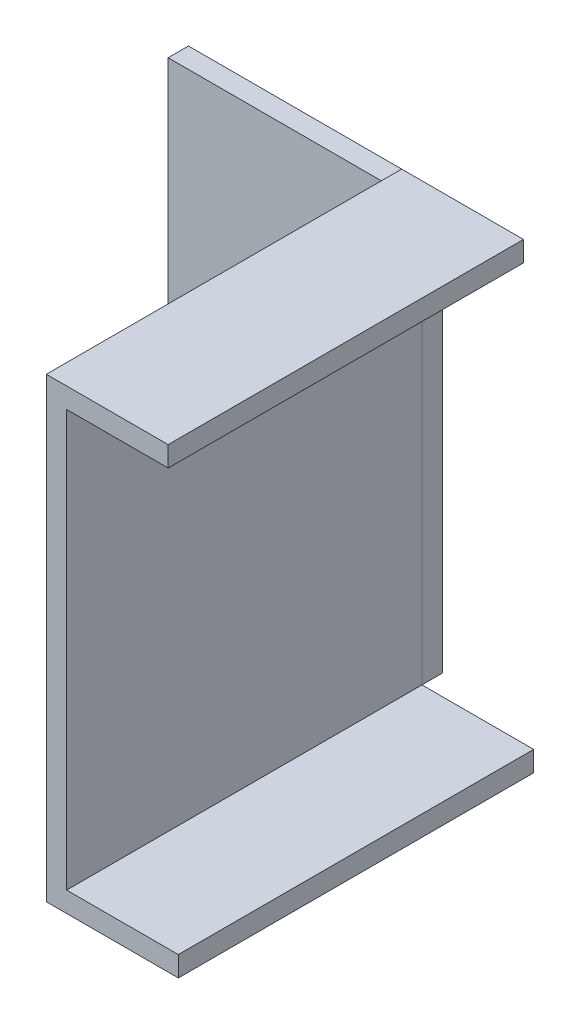
ISO-10303-21;
HEADER;
FILE_DESCRIPTION(('STEP AP214'),'2;1');
FILE_NAME('part.step','',(''),(''),'','','');
FILE_SCHEMA(('AUTOMOTIVE_DESIGN { 1 0 10303 214 1 1 1 1 }'));
ENDSEC;
DATA;
#1=APPLICATION_CONTEXT('core data for automotive mechanical design processes');
#2=APPLICATION_PROTOCOL_DEFINITION('international standard','automotive_design',2000,#1);
#3=PRODUCT_CONTEXT('',#1,'mechanical');
#4=PRODUCT('Part','Part','',(#3));
#5=PRODUCT_RELATED_PRODUCT_CATEGORY('part','',(#4));
#6=PRODUCT_DEFINITION_FORMATION('','',#4);
#7=PRODUCT_DEFINITION_CONTEXT('part definition',#1,'design');
#8=PRODUCT_DEFINITION('design','',#6,#7);
#9=PRODUCT_DEFINITION_SHAPE('','',#8);
#10=(LENGTH_UNIT() NAMED_UNIT(*) SI_UNIT(.MILLI.,.METRE.));
#11=(NAMED_UNIT(*) PLANE_ANGLE_UNIT() SI_UNIT($,.RADIAN.));
#12=(NAMED_UNIT(*) SI_UNIT($,.STERADIAN.) SOLID_ANGLE_UNIT());
#13=UNCERTAINTY_MEASURE_WITH_UNIT(LENGTH_MEASURE(1.E-05),#10,'distance_accuracy_value','');
#14=(GEOMETRIC_REPRESENTATION_CONTEXT(3) GLOBAL_UNCERTAINTY_ASSIGNED_CONTEXT((#13)) GLOBAL_UNIT_ASSIGNED_CONTEXT((#10,
#11,#12)) REPRESENTATION_CONTEXT('',''));
#15=CARTESIAN_POINT('',(0.,0.,0.));
#16=DIRECTION('',(0.,0.,1.));
#17=DIRECTION('',(1.,0.,0.));
#18=AXIS2_PLACEMENT_3D('',#15,#16,#17);
#19=CARTESIAN_POINT('',(2.,43.,-2.));
#20=DIRECTION('',(-1.,0.,0.));
#21=DIRECTION('',(0.,-1.,0.));
#22=AXIS2_PLACEMENT_3D('',#19,#20,#21);
#23=PLANE('',#22);
#24=DIRECTION('',(0.,-1.,0.));
#25=VECTOR('',#24,1.);
#26=CARTESIAN_POINT('',(2.,43.,0.));
#27=LINE('',#26,#25);
#28=CARTESIAN_POINT('',(2.,43.,0.));
#29=VERTEX_POINT('',#28);
#30=CARTESIAN_POINT('',(2.,2.,0.));
#31=VERTEX_POINT('',#30);
#32=EDGE_CURVE('E112',#29,#31,#27,.T.);
#33=ORIENTED_EDGE('',*,*,#32,.T.);
#34=DIRECTION('',(0.,0.,1.));
#35=VECTOR('',#34,1.);
#36=CARTESIAN_POINT('',(2.,2.,-2.));
#37=LINE('',#36,#35);
#38=CARTESIAN_POINT('',(2.,2.,-2.));
#39=VERTEX_POINT('',#38);
#40=EDGE_CURVE('E12',#39,#31,#37,.T.);
#41=ORIENTED_EDGE('',*,*,#40,.F.);
#42=DIRECTION('',(0.,-1.,0.));
#43=VECTOR('',#42,1.);
#44=CARTESIAN_POINT('',(2.,43.,-2.));
#45=LINE('',#44,#43);
#46=CARTESIAN_POINT('',(2.,43.,-2.));
#47=VERTEX_POINT('',#46);
#48=EDGE_CURVE('E100',#47,#39,#45,.T.);
#49=ORIENTED_EDGE('',*,*,#48,.F.);
#50=DIRECTION('',(0.,0.,1.));
#51=VECTOR('',#50,1.);
#52=CARTESIAN_POINT('',(2.,43.,-2.));
#53=LINE('',#52,#51);
#54=EDGE_CURVE('E108',#47,#29,#53,.T.);
#55=ORIENTED_EDGE('',*,*,#54,.T.);
#56=EDGE_LOOP('',(#33,#41,#49,#55));
#57=FACE_BOUND('',#56,.T.);
#58=ADVANCED_FACE('F49',(#57),#23,.F.);
#59=CARTESIAN_POINT('',(2.,2.,-2.));
#60=DIRECTION('',(0.,1.,0.));
#61=DIRECTION('',(-1.,0.,0.));
#62=AXIS2_PLACEMENT_3D('',#59,#60,#61);
#63=PLANE('',#62);
#64=DIRECTION('',(-1.,0.,0.));
#65=VECTOR('',#64,1.);
#66=CARTESIAN_POINT('',(2.,2.,0.));
#67=LINE('',#66,#65);
#68=CARTESIAN_POINT('',(-23.,2.,0.));
#69=VERTEX_POINT('',#68);
#70=EDGE_CURVE('E104',#31,#69,#67,.T.);
#71=ORIENTED_EDGE('',*,*,#70,.T.);
#72=DIRECTION('',(0.,0.,1.));
#73=VECTOR('',#72,1.);
#74=CARTESIAN_POINT('',(-23.,2.,-2.));
#75=LINE('',#74,#73);
#76=CARTESIAN_POINT('',(-23.,2.,-2.));
#77=VERTEX_POINT('',#76);
#78=EDGE_CURVE('E57',#77,#69,#75,.T.);
#79=ORIENTED_EDGE('',*,*,#78,.F.);
#80=DIRECTION('',(-1.,0.,0.));
#81=VECTOR('',#80,1.);
#82=CARTESIAN_POINT('',(2.,2.,-2.));
#83=LINE('',#82,#81);
#84=EDGE_CURVE('E95',#39,#77,#83,.T.);
#85=ORIENTED_EDGE('',*,*,#84,.F.);
#86=ORIENTED_EDGE('',*,*,#40,.T.);
#87=EDGE_LOOP('',(#71,#79,#85,#86));
#88=FACE_BOUND('',#87,.T.);
#89=ADVANCED_FACE('F103',(#88),#63,.F.);
#90=CARTESIAN_POINT('',(-23.,43.,-2.));
#91=DIRECTION('',(1.,0.,0.));
#92=DIRECTION('',(0.,1.,0.));
#93=AXIS2_PLACEMENT_3D('',#90,#91,#92);
#94=PLANE('',#93);
#95=DIRECTION('',(0.,1.,0.));
#96=VECTOR('',#95,1.);
#97=CARTESIAN_POINT('',(-23.,43.,0.));
#98=LINE('',#97,#96);
#99=CARTESIAN_POINT('',(-23.,43.,0.));
#100=VERTEX_POINT('',#99);
#101=EDGE_CURVE('E82',#69,#100,#98,.T.);
#102=ORIENTED_EDGE('',*,*,#101,.T.);
#103=DIRECTION('',(0.,0.,1.));
#104=VECTOR('',#103,1.);
#105=CARTESIAN_POINT('',(-23.,43.,-2.));
#106=LINE('',#105,#104);
#107=CARTESIAN_POINT('',(-23.,43.,-2.));
#108=VERTEX_POINT('',#107);
#109=EDGE_CURVE('E105',#108,#100,#106,.T.);
#110=ORIENTED_EDGE('',*,*,#109,.F.);
#111=DIRECTION('',(0.,1.,0.));
#112=VECTOR('',#111,1.);
#113=CARTESIAN_POINT('',(-23.,43.,-2.));
#114=LINE('',#113,#112);
#115=EDGE_CURVE('E98',#77,#108,#114,.T.);
#116=ORIENTED_EDGE('',*,*,#115,.F.);
#117=ORIENTED_EDGE('',*,*,#78,.T.);
#118=EDGE_LOOP('',(#102,#110,#116,#117));
#119=FACE_BOUND('',#118,.T.);
#120=ADVANCED_FACE('F106',(#119),#94,.F.);
#121=CARTESIAN_POINT('',(2.,43.,-2.));
#122=DIRECTION('',(0.,-1.,0.));
#123=DIRECTION('',(0.,0.,-1.));
#124=AXIS2_PLACEMENT_3D('',#121,#122,#123);
#125=PLANE('',#124);
#126=DIRECTION('',(1.,0.,0.));
#127=VECTOR('',#126,1.);
#128=CARTESIAN_POINT('',(2.,43.,0.));
#129=LINE('',#128,#127);
#130=EDGE_CURVE('E88',#100,#29,#129,.T.);
#131=ORIENTED_EDGE('',*,*,#130,.T.);
#132=ORIENTED_EDGE('',*,*,#54,.F.);
#133=DIRECTION('',(1.,0.,0.));
#134=VECTOR('',#133,1.);
#135=CARTESIAN_POINT('',(2.,43.,-2.));
#136=LINE('',#135,#134);
#137=EDGE_CURVE('E65',#108,#47,#136,.T.);
#138=ORIENTED_EDGE('',*,*,#137,.F.);
#139=ORIENTED_EDGE('',*,*,#109,.T.);
#140=EDGE_LOOP('',(#131,#132,#138,#139));
#141=FACE_BOUND('',#140,.T.);
#142=ADVANCED_FACE('F119',(#141),#125,.F.);
#143=CARTESIAN_POINT('',(0.,0.,-2.));
#144=DIRECTION('',(0.,0.,-1.));
#145=DIRECTION('',(-1.,0.,0.));
#146=AXIS2_PLACEMENT_3D('',#143,#144,#145);
#147=PLANE('',#146);
#148=ORIENTED_EDGE('',*,*,#48,.T.);
#149=ORIENTED_EDGE('',*,*,#84,.T.);
#150=ORIENTED_EDGE('',*,*,#115,.T.);
#151=ORIENTED_EDGE('',*,*,#137,.T.);
#152=EDGE_LOOP('',(#148,#149,#150,#151));
#153=FACE_BOUND('',#152,.T.);
#154=ADVANCED_FACE('F96',(#153),#147,.T.);
#155=CARTESIAN_POINT('',(0.,0.,0.));
#156=DIRECTION('',(0.,0.,-1.));
#157=DIRECTION('',(-1.,0.,0.));
#158=AXIS2_PLACEMENT_3D('',#155,#156,#157);
#159=PLANE('',#158);
#160=ORIENTED_EDGE('',*,*,#32,.F.);
#161=ORIENTED_EDGE('',*,*,#130,.F.);
#162=ORIENTED_EDGE('',*,*,#101,.F.);
#163=ORIENTED_EDGE('',*,*,#70,.F.);
#164=EDGE_LOOP('',(#160,#161,#162,#163));
#165=FACE_BOUND('',#164,.T.);
#166=ADVANCED_FACE('F122',(#165),#159,.F.);
#167=CLOSED_SHELL('',(#58,#89,#120,#142,#154,#166));
#168=MANIFOLD_SOLID_BREP('B2',#167);
#169=CARTESIAN_POINT('',(13.,0.,35.));
#170=DIRECTION('',(0.,1.,0.));
#171=DIRECTION('',(-1.,0.,0.));
#172=AXIS2_PLACEMENT_3D('',#169,#170,#171);
#173=PLANE('',#172);
#174=DIRECTION('',(1.,0.,0.));
#175=VECTOR('',#174,1.);
#176=CARTESIAN_POINT('',(13.,0.,0.));
#177=LINE('',#176,#175);
#178=CARTESIAN_POINT('',(0.,0.,0.));
#179=VERTEX_POINT('',#178);
#180=CARTESIAN_POINT('',(13.,0.,0.));
#181=VERTEX_POINT('',#180);
#182=EDGE_CURVE('E274',#179,#181,#177,.T.);
#183=ORIENTED_EDGE('',*,*,#182,.T.);
#184=DIRECTION('',(0.,0.,-1.));
#185=VECTOR('',#184,1.);
#186=CARTESIAN_POINT('',(13.,0.,35.));
#187=LINE('',#186,#185);
#188=CARTESIAN_POINT('',(13.,0.,35.));
#189=VERTEX_POINT('',#188);
#190=EDGE_CURVE('E47',#189,#181,#187,.T.);
#191=ORIENTED_EDGE('',*,*,#190,.F.);
#192=DIRECTION('',(1.,0.,0.));
#193=VECTOR('',#192,1.);
#194=CARTESIAN_POINT('',(13.,0.,35.));
#195=LINE('',#194,#193);
#196=CARTESIAN_POINT('',(0.,0.,35.));
#197=VERTEX_POINT('',#196);
#198=EDGE_CURVE('E296',#197,#189,#195,.T.);
#199=ORIENTED_EDGE('',*,*,#198,.F.);
#200=DIRECTION('',(0.,0.,-1.));
#201=VECTOR('',#200,1.);
#202=CARTESIAN_POINT('',(0.,0.,35.));
#203=LINE('',#202,#201);
#204=EDGE_CURVE('E270',#197,#179,#203,.T.);
#205=ORIENTED_EDGE('',*,*,#204,.T.);
#206=EDGE_LOOP('',(#183,#191,#199,#205));
#207=FACE_BOUND('',#206,.T.);
#208=ADVANCED_FACE('F173',(#207),#173,.F.);
#209=CARTESIAN_POINT('',(13.,2.,35.));
#210=DIRECTION('',(-1.,0.,0.));
#211=DIRECTION('',(0.,0.,1.));
#212=AXIS2_PLACEMENT_3D('',#209,#210,#211);
#213=PLANE('',#212);
#214=DIRECTION('',(0.,1.,0.));
#215=VECTOR('',#214,1.);
#216=CARTESIAN_POINT('',(13.,2.,0.));
#217=LINE('',#216,#215);
#218=CARTESIAN_POINT('',(13.,2.,0.));
#219=VERTEX_POINT('',#218);
#220=EDGE_CURVE('E278',#181,#219,#217,.T.);
#221=ORIENTED_EDGE('',*,*,#220,.T.);
#222=DIRECTION('',(0.,0.,-1.));
#223=VECTOR('',#222,1.);
#224=CARTESIAN_POINT('',(13.,2.,35.));
#225=LINE('',#224,#223);
#226=CARTESIAN_POINT('',(13.,2.,35.));
#227=VERTEX_POINT('',#226);
#228=EDGE_CURVE('E182',#227,#219,#225,.T.);
#229=ORIENTED_EDGE('',*,*,#228,.F.);
#230=DIRECTION('',(0.,1.,0.));
#231=VECTOR('',#230,1.);
#232=CARTESIAN_POINT('',(13.,2.,35.));
#233=LINE('',#232,#231);
#234=EDGE_CURVE('E233',#189,#227,#233,.T.);
#235=ORIENTED_EDGE('',*,*,#234,.F.);
#236=ORIENTED_EDGE('',*,*,#190,.T.);
#237=EDGE_LOOP('',(#221,#229,#235,#236));
#238=FACE_BOUND('',#237,.T.);
#239=ADVANCED_FACE('F342',(#238),#213,.F.);
#240=CARTESIAN_POINT('',(2.,2.,35.));
#241=DIRECTION('',(0.,-1.,0.));
#242=DIRECTION('',(1.,0.,0.));
#243=AXIS2_PLACEMENT_3D('',#240,#241,#242);
#244=PLANE('',#243);
#245=DIRECTION('',(-1.,0.,0.));
#246=VECTOR('',#245,1.);
#247=CARTESIAN_POINT('',(2.,2.,0.));
#248=LINE('',#247,#246);
#249=CARTESIAN_POINT('',(2.,2.,0.));
#250=VERTEX_POINT('',#249);
#251=EDGE_CURVE('E281',#219,#250,#248,.T.);
#252=ORIENTED_EDGE('',*,*,#251,.T.);
#253=DIRECTION('',(0.,0.,-1.));
#254=VECTOR('',#253,1.);
#255=CARTESIAN_POINT('',(2.,2.,35.));
#256=LINE('',#255,#254);
#257=CARTESIAN_POINT('',(2.,2.,35.));
#258=VERTEX_POINT('',#257);
#259=EDGE_CURVE('E307',#258,#250,#256,.T.);
#260=ORIENTED_EDGE('',*,*,#259,.F.);
#261=DIRECTION('',(-1.,0.,0.));
#262=VECTOR('',#261,1.);
#263=CARTESIAN_POINT('',(2.,2.,35.));
#264=LINE('',#263,#262);
#265=EDGE_CURVE('E317',#227,#258,#264,.T.);
#266=ORIENTED_EDGE('',*,*,#265,.F.);
#267=ORIENTED_EDGE('',*,*,#228,.T.);
#268=EDGE_LOOP('',(#252,#260,#266,#267));
#269=FACE_BOUND('',#268,.T.);
#270=ADVANCED_FACE('F315',(#269),#244,.F.);
#271=CARTESIAN_POINT('',(2.,43.,35.));
#272=DIRECTION('',(-1.,0.,0.));
#273=DIRECTION('',(0.,-1.,0.));
#274=AXIS2_PLACEMENT_3D('',#271,#272,#273);
#275=PLANE('',#274);
#276=DIRECTION('',(0.,1.,0.));
#277=VECTOR('',#276,1.);
#278=CARTESIAN_POINT('',(2.,43.,0.));
#279=LINE('',#278,#277);
#280=CARTESIAN_POINT('',(2.,43.,0.));
#281=VERTEX_POINT('',#280);
#282=EDGE_CURVE('E284',#250,#281,#279,.T.);
#283=ORIENTED_EDGE('',*,*,#282,.T.);
#284=DIRECTION('',(0.,0.,-1.));
#285=VECTOR('',#284,1.);
#286=CARTESIAN_POINT('',(2.,43.,35.));
#287=LINE('',#286,#285);
#288=CARTESIAN_POINT('',(2.,43.,35.));
#289=VERTEX_POINT('',#288);
#290=EDGE_CURVE('E303',#289,#281,#287,.T.);
#291=ORIENTED_EDGE('',*,*,#290,.F.);
#292=DIRECTION('',(0.,1.,0.));
#293=VECTOR('',#292,1.);
#294=CARTESIAN_POINT('',(2.,43.,35.));
#295=LINE('',#294,#293);
#296=EDGE_CURVE('E330',#258,#289,#295,.T.);
#297=ORIENTED_EDGE('',*,*,#296,.F.);
#298=ORIENTED_EDGE('',*,*,#259,.T.);
#299=EDGE_LOOP('',(#283,#291,#297,#298));
#300=FACE_BOUND('',#299,.T.);
#301=ADVANCED_FACE('F325',(#300),#275,.F.);
#302=CARTESIAN_POINT('',(12.,43.,35.));
#303=DIRECTION('',(0.,1.,0.));
#304=DIRECTION('',(0.,0.,1.));
#305=AXIS2_PLACEMENT_3D('',#302,#303,#304);
#306=PLANE('',#305);
#307=DIRECTION('',(1.,0.,0.));
#308=VECTOR('',#307,1.);
#309=CARTESIAN_POINT('',(12.,43.,0.));
#310=LINE('',#309,#308);
#311=CARTESIAN_POINT('',(12.,43.,0.));
#312=VERTEX_POINT('',#311);
#313=EDGE_CURVE('E287',#281,#312,#310,.T.);
#314=ORIENTED_EDGE('',*,*,#313,.T.);
#315=DIRECTION('',(0.,0.,-1.));
#316=VECTOR('',#315,1.);
#317=CARTESIAN_POINT('',(12.,43.,35.));
#318=LINE('',#317,#316);
#319=CARTESIAN_POINT('',(12.,43.,35.));
#320=VERTEX_POINT('',#319);
#321=EDGE_CURVE('E263',#320,#312,#318,.T.);
#322=ORIENTED_EDGE('',*,*,#321,.F.);
#323=DIRECTION('',(1.,0.,0.));
#324=VECTOR('',#323,1.);
#325=CARTESIAN_POINT('',(12.,43.,35.));
#326=LINE('',#325,#324);
#327=EDGE_CURVE('E252',#289,#320,#326,.T.);
#328=ORIENTED_EDGE('',*,*,#327,.F.);
#329=ORIENTED_EDGE('',*,*,#290,.T.);
#330=EDGE_LOOP('',(#314,#322,#328,#329));
#331=FACE_BOUND('',#330,.T.);
#332=ADVANCED_FACE('F328',(#331),#306,.F.);
#333=CARTESIAN_POINT('',(12.,45.,35.));
#334=DIRECTION('',(-1.,0.,0.));
#335=DIRECTION('',(0.,0.,1.));
#336=AXIS2_PLACEMENT_3D('',#333,#334,#335);
#337=PLANE('',#336);
#338=DIRECTION('',(0.,1.,0.));
#339=VECTOR('',#338,1.);
#340=CARTESIAN_POINT('',(12.,45.,0.));
#341=LINE('',#340,#339);
#342=CARTESIAN_POINT('',(12.,45.,0.));
#343=VERTEX_POINT('',#342);
#344=EDGE_CURVE('E261',#312,#343,#341,.T.);
#345=ORIENTED_EDGE('',*,*,#344,.T.);
#346=DIRECTION('',(0.,0.,-1.));
#347=VECTOR('',#346,1.);
#348=CARTESIAN_POINT('',(12.,45.,35.));
#349=LINE('',#348,#347);
#350=CARTESIAN_POINT('',(12.,45.,35.));
#351=VERTEX_POINT('',#350);
#352=EDGE_CURVE('E258',#351,#343,#349,.T.);
#353=ORIENTED_EDGE('',*,*,#352,.F.);
#354=DIRECTION('',(0.,1.,0.));
#355=VECTOR('',#354,1.);
#356=CARTESIAN_POINT('',(12.,45.,35.));
#357=LINE('',#356,#355);
#358=EDGE_CURVE('E246',#320,#351,#357,.T.);
#359=ORIENTED_EDGE('',*,*,#358,.F.);
#360=ORIENTED_EDGE('',*,*,#321,.T.);
#361=EDGE_LOOP('',(#345,#353,#359,#360));
#362=FACE_BOUND('',#361,.T.);
#363=ADVANCED_FACE('F259',(#362),#337,.F.);
#364=CARTESIAN_POINT('',(0.,45.,35.));
#365=DIRECTION('',(0.,-1.,0.));
#366=DIRECTION('',(0.,0.,-1.));
#367=AXIS2_PLACEMENT_3D('',#364,#365,#366);
#368=PLANE('',#367);
#369=DIRECTION('',(-1.,0.,0.));
#370=VECTOR('',#369,1.);
#371=CARTESIAN_POINT('',(0.,45.,0.));
#372=LINE('',#371,#370);
#373=CARTESIAN_POINT('',(0.,45.,0.));
#374=VERTEX_POINT('',#373);
#375=EDGE_CURVE('E219',#343,#374,#372,.T.);
#376=ORIENTED_EDGE('',*,*,#375,.T.);
#377=DIRECTION('',(0.,0.,-1.));
#378=VECTOR('',#377,1.);
#379=CARTESIAN_POINT('',(0.,45.,35.));
#380=LINE('',#379,#378);
#381=CARTESIAN_POINT('',(0.,45.,35.));
#382=VERTEX_POINT('',#381);
#383=EDGE_CURVE('E264',#382,#374,#380,.T.);
#384=ORIENTED_EDGE('',*,*,#383,.F.);
#385=DIRECTION('',(-1.,0.,0.));
#386=VECTOR('',#385,1.);
#387=CARTESIAN_POINT('',(0.,45.,35.));
#388=LINE('',#387,#386);
#389=EDGE_CURVE('E250',#351,#382,#388,.T.);
#390=ORIENTED_EDGE('',*,*,#389,.F.);
#391=ORIENTED_EDGE('',*,*,#352,.T.);
#392=EDGE_LOOP('',(#376,#384,#390,#391));
#393=FACE_BOUND('',#392,.T.);
#394=ADVANCED_FACE('F266',(#393),#368,.F.);
#395=CARTESIAN_POINT('',(0.,0.,35.));
#396=DIRECTION('',(1.,0.,0.));
#397=DIRECTION('',(0.,0.,-1.));
#398=AXIS2_PLACEMENT_3D('',#395,#396,#397);
#399=PLANE('',#398);
#400=DIRECTION('',(0.,-1.,0.));
#401=VECTOR('',#400,1.);
#402=CARTESIAN_POINT('',(0.,0.,0.));
#403=LINE('',#402,#401);
#404=EDGE_CURVE('E225',#374,#179,#403,.T.);
#405=ORIENTED_EDGE('',*,*,#404,.T.);
#406=ORIENTED_EDGE('',*,*,#204,.F.);
#407=DIRECTION('',(0.,-1.,0.));
#408=VECTOR('',#407,1.);
#409=CARTESIAN_POINT('',(0.,0.,35.));
#410=LINE('',#409,#408);
#411=EDGE_CURVE('E190',#382,#197,#410,.T.);
#412=ORIENTED_EDGE('',*,*,#411,.F.);
#413=ORIENTED_EDGE('',*,*,#383,.T.);
#414=EDGE_LOOP('',(#405,#406,#412,#413));
#415=FACE_BOUND('',#414,.T.);
#416=ADVANCED_FACE('F358',(#415),#399,.F.);
#417=CARTESIAN_POINT('',(0.,0.,35.));
#418=DIRECTION('',(0.,0.,-1.));
#419=DIRECTION('',(-1.,0.,0.));
#420=AXIS2_PLACEMENT_3D('',#417,#418,#419);
#421=PLANE('',#420);
#422=ORIENTED_EDGE('',*,*,#198,.T.);
#423=ORIENTED_EDGE('',*,*,#234,.T.);
#424=ORIENTED_EDGE('',*,*,#265,.T.);
#425=ORIENTED_EDGE('',*,*,#296,.T.);
#426=ORIENTED_EDGE('',*,*,#327,.T.);
#427=ORIENTED_EDGE('',*,*,#358,.T.);
#428=ORIENTED_EDGE('',*,*,#389,.T.);
#429=ORIENTED_EDGE('',*,*,#411,.T.);
#430=EDGE_LOOP('',(#422,#423,#424,#425,#426,#427,#428,#429));
#431=FACE_BOUND('',#430,.T.);
#432=ADVANCED_FACE('F248',(#431),#421,.F.);
#433=CARTESIAN_POINT('',(0.,0.,0.));
#434=DIRECTION('',(0.,0.,-1.));
#435=DIRECTION('',(-1.,0.,0.));
#436=AXIS2_PLACEMENT_3D('',#433,#434,#435);
#437=PLANE('',#436);
#438=ORIENTED_EDGE('',*,*,#182,.F.);
#439=ORIENTED_EDGE('',*,*,#404,.F.);
#440=ORIENTED_EDGE('',*,*,#375,.F.);
#441=ORIENTED_EDGE('',*,*,#344,.F.);
#442=ORIENTED_EDGE('',*,*,#313,.F.);
#443=ORIENTED_EDGE('',*,*,#282,.F.);
#444=ORIENTED_EDGE('',*,*,#251,.F.);
#445=ORIENTED_EDGE('',*,*,#220,.F.);
#446=EDGE_LOOP('',(#438,#439,#440,#441,#442,#443,#444,#445));
#447=FACE_BOUND('',#446,.T.);
#448=ADVANCED_FACE('F321',(#447),#437,.T.);
#449=CLOSED_SHELL('',(#208,#239,#270,#301,#332,#363,#394,#416,#432,#448));
#450=MANIFOLD_SOLID_BREP('B6',#449);
#451=ADVANCED_BREP_SHAPE_REPRESENTATION('',(#18,#168,#450),#14);
#452=SHAPE_DEFINITION_REPRESENTATION(#9,#451);
ENDSEC;
END-ISO-10303-21;
